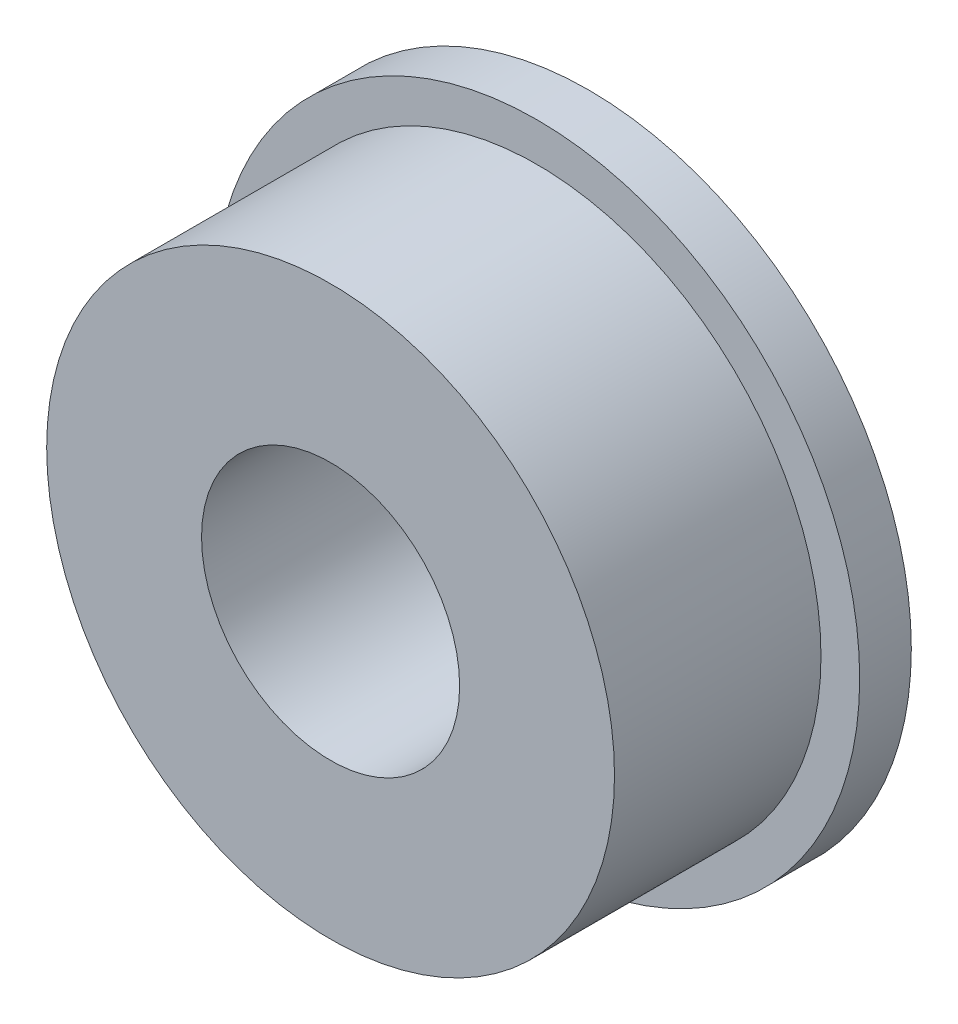
ISO-10303-21;
HEADER;
FILE_DESCRIPTION(('STEP AP214'),'2;1');
FILE_NAME('part.step','',(''),(''),'','','');
FILE_SCHEMA(('AUTOMOTIVE_DESIGN { 1 0 10303 214 1 1 1 1 }'));
ENDSEC;
DATA;
#1=APPLICATION_CONTEXT('core data for automotive mechanical design processes');
#2=APPLICATION_PROTOCOL_DEFINITION('international standard','automotive_design',2000,#1);
#3=PRODUCT_CONTEXT('',#1,'mechanical');
#4=PRODUCT('Part','Part','',(#3));
#5=PRODUCT_RELATED_PRODUCT_CATEGORY('part','',(#4));
#6=PRODUCT_DEFINITION_FORMATION('','',#4);
#7=PRODUCT_DEFINITION_CONTEXT('part definition',#1,'design');
#8=PRODUCT_DEFINITION('design','',#6,#7);
#9=PRODUCT_DEFINITION_SHAPE('','',#8);
#10=(LENGTH_UNIT() NAMED_UNIT(*) SI_UNIT(.MILLI.,.METRE.));
#11=(NAMED_UNIT(*) PLANE_ANGLE_UNIT() SI_UNIT($,.RADIAN.));
#12=(NAMED_UNIT(*) SI_UNIT($,.STERADIAN.) SOLID_ANGLE_UNIT());
#13=UNCERTAINTY_MEASURE_WITH_UNIT(LENGTH_MEASURE(1.E-05),#10,'distance_accuracy_value','');
#14=(GEOMETRIC_REPRESENTATION_CONTEXT(3) GLOBAL_UNCERTAINTY_ASSIGNED_CONTEXT((#13)) GLOBAL_UNIT_ASSIGNED_CONTEXT((#10,
#11,#12)) REPRESENTATION_CONTEXT('',''));
#15=CARTESIAN_POINT('',(0.,0.,0.));
#16=DIRECTION('',(0.,0.,1.));
#17=DIRECTION('',(1.,0.,0.));
#18=AXIS2_PLACEMENT_3D('',#15,#16,#17);
#19=CARTESIAN_POINT('',(0.,0.,1.));
#20=DIRECTION('',(0.,0.,-1.));
#21=DIRECTION('',(-1.,0.,0.));
#22=AXIS2_PLACEMENT_3D('',#19,#20,#21);
#23=CYLINDRICAL_SURFACE('',#22,6.25);
#24=CARTESIAN_POINT('',(0.,0.,1.));
#25=DIRECTION('',(0.,0.,1.));
#26=DIRECTION('',(1.,0.,0.));
#27=AXIS2_PLACEMENT_3D('',#24,#25,#26);
#28=CIRCLE('',#27,6.25);
#29=CARTESIAN_POINT('',(6.25,0.,1.));
#30=VERTEX_POINT('',#29);
#31=EDGE_CURVE('E44',#30,#30,#28,.T.);
#32=ORIENTED_EDGE('',*,*,#31,.F.);
#33=EDGE_LOOP('',(#32));
#34=FACE_BOUND('',#33,.T.);
#35=CARTESIAN_POINT('',(0.,0.,0.));
#36=DIRECTION('',(0.,0.,1.));
#37=DIRECTION('',(1.,0.,0.));
#38=AXIS2_PLACEMENT_3D('',#35,#36,#37);
#39=CIRCLE('',#38,6.25);
#40=CARTESIAN_POINT('',(6.25,0.,0.));
#41=VERTEX_POINT('',#40);
#42=EDGE_CURVE('E40',#41,#41,#39,.T.);
#43=ORIENTED_EDGE('',*,*,#42,.T.);
#44=EDGE_LOOP('',(#43));
#45=FACE_BOUND('',#44,.T.);
#46=ADVANCED_FACE('F37',(#34,#45),#23,.T.);
#47=CARTESIAN_POINT('',(0.,0.,1.));
#48=DIRECTION('',(0.,0.,1.));
#49=DIRECTION('',(1.,0.,0.));
#50=AXIS2_PLACEMENT_3D('',#47,#48,#49);
#51=PLANE('',#50);
#52=CARTESIAN_POINT('',(0.,0.,1.));
#53=DIRECTION('',(0.,0.,1.));
#54=DIRECTION('',(1.,0.,0.));
#55=AXIS2_PLACEMENT_3D('',#52,#53,#54);
#56=CIRCLE('',#55,5.5);
#57=CARTESIAN_POINT('',(5.5,0.,1.));
#58=VERTEX_POINT('',#57);
#59=EDGE_CURVE('E10',#58,#58,#56,.T.);
#60=ORIENTED_EDGE('',*,*,#59,.F.);
#61=EDGE_LOOP('',(#60));
#62=FACE_BOUND('',#61,.T.);
#63=ORIENTED_EDGE('',*,*,#31,.T.);
#64=EDGE_LOOP('',(#63));
#65=FACE_BOUND('',#64,.T.);
#66=ADVANCED_FACE('F75',(#62,#65),#51,.T.);
#67=CARTESIAN_POINT('',(0.,0.,0.));
#68=DIRECTION('',(0.,0.,1.));
#69=DIRECTION('',(1.,0.,0.));
#70=AXIS2_PLACEMENT_3D('',#67,#68,#69);
#71=PLANE('',#70);
#72=CARTESIAN_POINT('',(0.,0.,0.));
#73=DIRECTION('',(0.,0.,1.));
#74=DIRECTION('',(1.,0.,0.));
#75=AXIS2_PLACEMENT_3D('',#72,#73,#74);
#76=CIRCLE('',#75,2.5);
#77=CARTESIAN_POINT('',(2.5,0.,0.));
#78=VERTEX_POINT('',#77);
#79=EDGE_CURVE('E53',#78,#78,#76,.F.);
#80=ORIENTED_EDGE('',*,*,#79,.F.);
#81=EDGE_LOOP('',(#80));
#82=FACE_BOUND('',#81,.T.);
#83=ORIENTED_EDGE('',*,*,#42,.F.);
#84=EDGE_LOOP('',(#83));
#85=FACE_BOUND('',#84,.T.);
#86=ADVANCED_FACE('F70',(#82,#85),#71,.F.);
#87=CARTESIAN_POINT('',(0.,0.,5.));
#88=DIRECTION('',(0.,0.,-1.));
#89=DIRECTION('',(-1.,0.,0.));
#90=AXIS2_PLACEMENT_3D('',#87,#88,#89);
#91=CYLINDRICAL_SURFACE('',#90,5.5);
#92=CARTESIAN_POINT('',(0.,0.,5.));
#93=DIRECTION('',(0.,0.,1.));
#94=DIRECTION('',(1.,0.,0.));
#95=AXIS2_PLACEMENT_3D('',#92,#93,#94);
#96=CIRCLE('',#95,5.5);
#97=CARTESIAN_POINT('',(5.5,0.,5.));
#98=VERTEX_POINT('',#97);
#99=EDGE_CURVE('E50',#98,#98,#96,.T.);
#100=ORIENTED_EDGE('',*,*,#99,.F.);
#101=EDGE_LOOP('',(#100));
#102=FACE_BOUND('',#101,.T.);
#103=ORIENTED_EDGE('',*,*,#59,.T.);
#104=EDGE_LOOP('',(#103));
#105=FACE_BOUND('',#104,.T.);
#106=ADVANCED_FACE('F65',(#102,#105),#91,.T.);
#107=CARTESIAN_POINT('',(0.,0.,5.));
#108=DIRECTION('',(0.,0.,1.));
#109=DIRECTION('',(1.,0.,0.));
#110=AXIS2_PLACEMENT_3D('',#107,#108,#109);
#111=PLANE('',#110);
#112=CARTESIAN_POINT('',(0.,0.,5.));
#113=DIRECTION('',(0.,0.,1.));
#114=DIRECTION('',(1.,0.,0.));
#115=AXIS2_PLACEMENT_3D('',#112,#113,#114);
#116=CIRCLE('',#115,2.5);
#117=CARTESIAN_POINT('',(2.5,0.,5.));
#118=VERTEX_POINT('',#117);
#119=EDGE_CURVE('E56',#118,#118,#116,.T.);
#120=ORIENTED_EDGE('',*,*,#119,.F.);
#121=EDGE_LOOP('',(#120));
#122=FACE_BOUND('',#121,.T.);
#123=ORIENTED_EDGE('',*,*,#99,.T.);
#124=EDGE_LOOP('',(#123));
#125=FACE_BOUND('',#124,.T.);
#126=ADVANCED_FACE('F62',(#122,#125),#111,.T.);
#127=CARTESIAN_POINT('',(0.,0.,-7.07106781186548));
#128=DIRECTION('',(0.,0.,1.));
#129=DIRECTION('',(1.,0.,0.));
#130=AXIS2_PLACEMENT_3D('',#127,#128,#129);
#131=CYLINDRICAL_SURFACE('',#130,2.5);
#132=ORIENTED_EDGE('',*,*,#79,.T.);
#133=EDGE_LOOP('',(#132));
#134=FACE_BOUND('',#133,.T.);
#135=ORIENTED_EDGE('',*,*,#119,.T.);
#136=EDGE_LOOP('',(#135));
#137=FACE_BOUND('',#136,.T.);
#138=ADVANCED_FACE('F60',(#134,#137),#131,.F.);
#139=CLOSED_SHELL('',(#46,#66,#86,#106,#126,#138));
#140=MANIFOLD_SOLID_BREP('B2',#139);
#141=ADVANCED_BREP_SHAPE_REPRESENTATION('',(#18,#140),#14);
#142=SHAPE_DEFINITION_REPRESENTATION(#9,#141);
ENDSEC;
END-ISO-10303-21;
